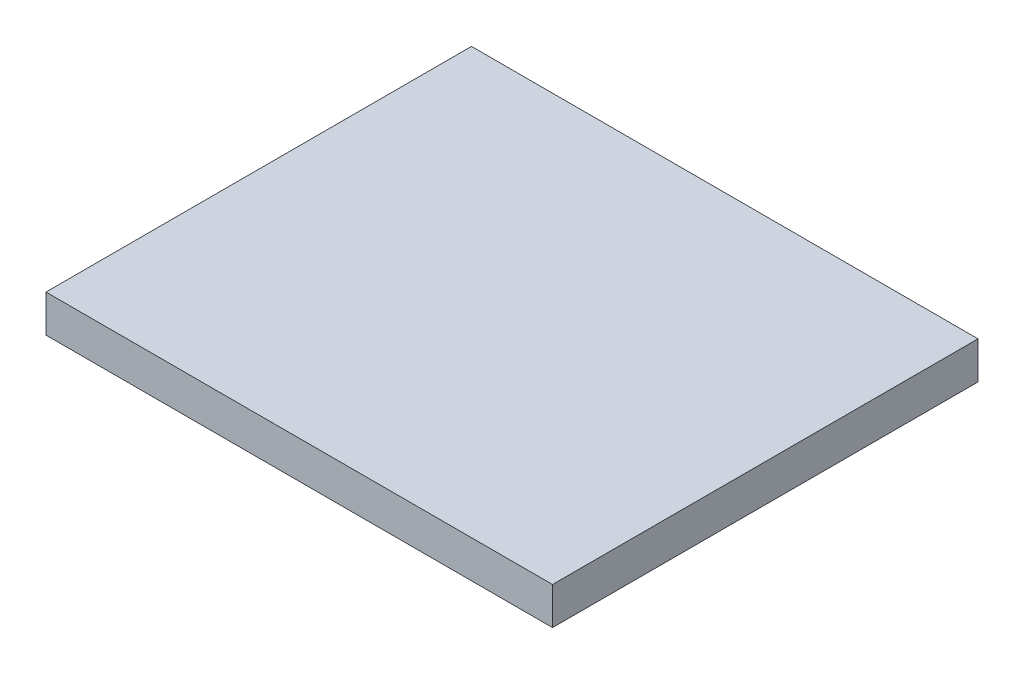
ISO-10303-21;
HEADER;
FILE_DESCRIPTION(('STEP AP214'),'2;1');
FILE_NAME('part.step','',(''),(''),'','','');
FILE_SCHEMA(('AUTOMOTIVE_DESIGN { 1 0 10303 214 1 1 1 1 }'));
ENDSEC;
DATA;
#1=APPLICATION_CONTEXT('core data for automotive mechanical design processes');
#2=APPLICATION_PROTOCOL_DEFINITION('international standard','automotive_design',2000,#1);
#3=PRODUCT_CONTEXT('',#1,'mechanical');
#4=PRODUCT('Part','Part','',(#3));
#5=PRODUCT_RELATED_PRODUCT_CATEGORY('part','',(#4));
#6=PRODUCT_DEFINITION_FORMATION('','',#4);
#7=PRODUCT_DEFINITION_CONTEXT('part definition',#1,'design');
#8=PRODUCT_DEFINITION('design','',#6,#7);
#9=PRODUCT_DEFINITION_SHAPE('','',#8);
#10=(LENGTH_UNIT() NAMED_UNIT(*) SI_UNIT(.MILLI.,.METRE.));
#11=(NAMED_UNIT(*) PLANE_ANGLE_UNIT() SI_UNIT($,.RADIAN.));
#12=(NAMED_UNIT(*) SI_UNIT($,.STERADIAN.) SOLID_ANGLE_UNIT());
#13=UNCERTAINTY_MEASURE_WITH_UNIT(LENGTH_MEASURE(1.E-05),#10,'distance_accuracy_value','');
#14=(GEOMETRIC_REPRESENTATION_CONTEXT(3) GLOBAL_UNCERTAINTY_ASSIGNED_CONTEXT((#13)) GLOBAL_UNIT_ASSIGNED_CONTEXT((#10,
#11,#12)) REPRESENTATION_CONTEXT('',''));
#15=CARTESIAN_POINT('',(0.,0.,0.));
#16=DIRECTION('',(0.,0.,1.));
#17=DIRECTION('',(1.,0.,0.));
#18=AXIS2_PLACEMENT_3D('',#15,#16,#17);
#19=CARTESIAN_POINT('',(62.5,9.215,52.5));
#20=DIRECTION('',(-1.,0.,0.));
#21=DIRECTION('',(0.,0.,1.));
#22=AXIS2_PLACEMENT_3D('',#19,#20,#21);
#23=PLANE('',#22);
#24=DIRECTION('',(0.,0.,-1.));
#25=VECTOR('',#24,1.);
#26=CARTESIAN_POINT('',(62.5,0.,52.5));
#27=LINE('',#26,#25);
#28=CARTESIAN_POINT('',(62.5,0.,52.5));
#29=VERTEX_POINT('',#28);
#30=CARTESIAN_POINT('',(62.5,0.,-52.5));
#31=VERTEX_POINT('',#30);
#32=EDGE_CURVE('E98',#29,#31,#27,.T.);
#33=ORIENTED_EDGE('',*,*,#32,.T.);
#34=DIRECTION('',(0.,-1.,0.));
#35=VECTOR('',#34,1.);
#36=CARTESIAN_POINT('',(62.5,9.215,-52.5));
#37=LINE('',#36,#35);
#38=CARTESIAN_POINT('',(62.5,9.215,-52.5));
#39=VERTEX_POINT('',#38);
#40=EDGE_CURVE('E11',#39,#31,#37,.T.);
#41=ORIENTED_EDGE('',*,*,#40,.F.);
#42=DIRECTION('',(0.,0.,-1.));
#43=VECTOR('',#42,1.);
#44=CARTESIAN_POINT('',(62.5,9.215,52.5));
#45=LINE('',#44,#43);
#46=CARTESIAN_POINT('',(62.5,9.215,52.5));
#47=VERTEX_POINT('',#46);
#48=EDGE_CURVE('E86',#47,#39,#45,.T.);
#49=ORIENTED_EDGE('',*,*,#48,.F.);
#50=DIRECTION('',(0.,-1.,0.));
#51=VECTOR('',#50,1.);
#52=CARTESIAN_POINT('',(62.5,9.215,52.5));
#53=LINE('',#52,#51);
#54=EDGE_CURVE('E94',#47,#29,#53,.T.);
#55=ORIENTED_EDGE('',*,*,#54,.T.);
#56=EDGE_LOOP('',(#33,#41,#49,#55));
#57=FACE_BOUND('',#56,.T.);
#58=ADVANCED_FACE('F35',(#57),#23,.F.);
#59=CARTESIAN_POINT('',(-62.5,9.215,-52.5));
#60=DIRECTION('',(0.,0.,1.));
#61=DIRECTION('',(1.,0.,0.));
#62=AXIS2_PLACEMENT_3D('',#59,#60,#61);
#63=PLANE('',#62);
#64=DIRECTION('',(-1.,0.,0.));
#65=VECTOR('',#64,1.);
#66=CARTESIAN_POINT('',(-62.5,0.,-52.5));
#67=LINE('',#66,#65);
#68=CARTESIAN_POINT('',(-62.5,0.,-52.5));
#69=VERTEX_POINT('',#68);
#70=EDGE_CURVE('E90',#31,#69,#67,.T.);
#71=ORIENTED_EDGE('',*,*,#70,.T.);
#72=DIRECTION('',(0.,-1.,0.));
#73=VECTOR('',#72,1.);
#74=CARTESIAN_POINT('',(-62.5,9.215,-52.5));
#75=LINE('',#74,#73);
#76=CARTESIAN_POINT('',(-62.5,9.215,-52.5));
#77=VERTEX_POINT('',#76);
#78=EDGE_CURVE('E43',#77,#69,#75,.T.);
#79=ORIENTED_EDGE('',*,*,#78,.F.);
#80=DIRECTION('',(-1.,0.,0.));
#81=VECTOR('',#80,1.);
#82=CARTESIAN_POINT('',(-62.5,9.215,-52.5));
#83=LINE('',#82,#81);
#84=EDGE_CURVE('E81',#39,#77,#83,.T.);
#85=ORIENTED_EDGE('',*,*,#84,.F.);
#86=ORIENTED_EDGE('',*,*,#40,.T.);
#87=EDGE_LOOP('',(#71,#79,#85,#86));
#88=FACE_BOUND('',#87,.T.);
#89=ADVANCED_FACE('F89',(#88),#63,.F.);
#90=CARTESIAN_POINT('',(-62.5,9.215,52.5));
#91=DIRECTION('',(1.,0.,0.));
#92=DIRECTION('',(0.,0.,-1.));
#93=AXIS2_PLACEMENT_3D('',#90,#91,#92);
#94=PLANE('',#93);
#95=DIRECTION('',(0.,0.,1.));
#96=VECTOR('',#95,1.);
#97=CARTESIAN_POINT('',(-62.5,0.,52.5));
#98=LINE('',#97,#96);
#99=CARTESIAN_POINT('',(-62.5,0.,52.5));
#100=VERTEX_POINT('',#99);
#101=EDGE_CURVE('E68',#69,#100,#98,.T.);
#102=ORIENTED_EDGE('',*,*,#101,.T.);
#103=DIRECTION('',(0.,-1.,0.));
#104=VECTOR('',#103,1.);
#105=CARTESIAN_POINT('',(-62.5,9.215,52.5));
#106=LINE('',#105,#104);
#107=CARTESIAN_POINT('',(-62.5,9.215,52.5));
#108=VERTEX_POINT('',#107);
#109=EDGE_CURVE('E91',#108,#100,#106,.T.);
#110=ORIENTED_EDGE('',*,*,#109,.F.);
#111=DIRECTION('',(0.,0.,1.));
#112=VECTOR('',#111,1.);
#113=CARTESIAN_POINT('',(-62.5,9.215,52.5));
#114=LINE('',#113,#112);
#115=EDGE_CURVE('E84',#77,#108,#114,.T.);
#116=ORIENTED_EDGE('',*,*,#115,.F.);
#117=ORIENTED_EDGE('',*,*,#78,.T.);
#118=EDGE_LOOP('',(#102,#110,#116,#117));
#119=FACE_BOUND('',#118,.T.);
#120=ADVANCED_FACE('F92',(#119),#94,.F.);
#121=CARTESIAN_POINT('',(-62.5,9.215,52.5));
#122=DIRECTION('',(0.,0.,-1.));
#123=DIRECTION('',(-1.,0.,0.));
#124=AXIS2_PLACEMENT_3D('',#121,#122,#123);
#125=PLANE('',#124);
#126=DIRECTION('',(1.,0.,0.));
#127=VECTOR('',#126,1.);
#128=CARTESIAN_POINT('',(-62.5,0.,52.5));
#129=LINE('',#128,#127);
#130=EDGE_CURVE('E74',#100,#29,#129,.T.);
#131=ORIENTED_EDGE('',*,*,#130,.T.);
#132=ORIENTED_EDGE('',*,*,#54,.F.);
#133=DIRECTION('',(1.,0.,0.));
#134=VECTOR('',#133,1.);
#135=CARTESIAN_POINT('',(-62.5,9.215,52.5));
#136=LINE('',#135,#134);
#137=EDGE_CURVE('E51',#108,#47,#136,.T.);
#138=ORIENTED_EDGE('',*,*,#137,.F.);
#139=ORIENTED_EDGE('',*,*,#109,.T.);
#140=EDGE_LOOP('',(#131,#132,#138,#139));
#141=FACE_BOUND('',#140,.T.);
#142=ADVANCED_FACE('F105',(#141),#125,.F.);
#143=CARTESIAN_POINT('',(0.,9.215,0.));
#144=DIRECTION('',(0.,-1.,0.));
#145=DIRECTION('',(0.,0.,-1.));
#146=AXIS2_PLACEMENT_3D('',#143,#144,#145);
#147=PLANE('',#146);
#148=ORIENTED_EDGE('',*,*,#48,.T.);
#149=ORIENTED_EDGE('',*,*,#84,.T.);
#150=ORIENTED_EDGE('',*,*,#115,.T.);
#151=ORIENTED_EDGE('',*,*,#137,.T.);
#152=EDGE_LOOP('',(#148,#149,#150,#151));
#153=FACE_BOUND('',#152,.T.);
#154=ADVANCED_FACE('F82',(#153),#147,.F.);
#155=CARTESIAN_POINT('',(0.,0.,0.));
#156=DIRECTION('',(0.,-1.,0.));
#157=DIRECTION('',(0.,0.,-1.));
#158=AXIS2_PLACEMENT_3D('',#155,#156,#157);
#159=PLANE('',#158);
#160=ORIENTED_EDGE('',*,*,#32,.F.);
#161=ORIENTED_EDGE('',*,*,#130,.F.);
#162=ORIENTED_EDGE('',*,*,#101,.F.);
#163=ORIENTED_EDGE('',*,*,#70,.F.);
#164=EDGE_LOOP('',(#160,#161,#162,#163));
#165=FACE_BOUND('',#164,.T.);
#166=ADVANCED_FACE('F108',(#165),#159,.T.);
#167=CLOSED_SHELL('',(#58,#89,#120,#142,#154,#166));
#168=MANIFOLD_SOLID_BREP('B2',#167);
#169=ADVANCED_BREP_SHAPE_REPRESENTATION('',(#18,#168),#14);
#170=SHAPE_DEFINITION_REPRESENTATION(#9,#169);
ENDSEC;
END-ISO-10303-21;
